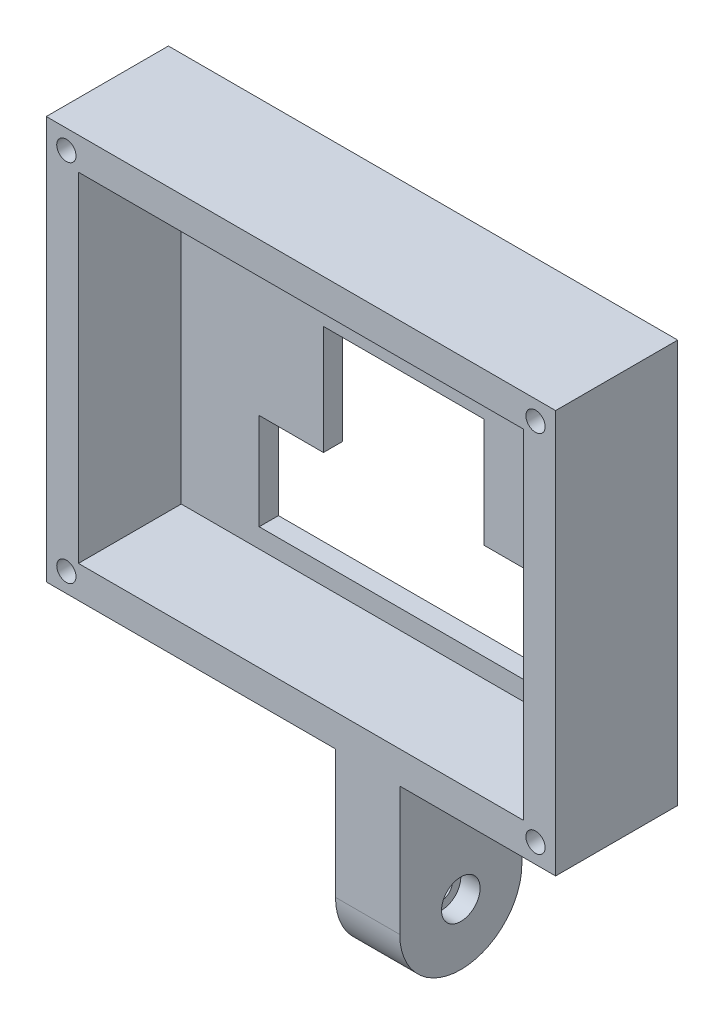
ISO-10303-21;
HEADER;
FILE_DESCRIPTION(('STEP AP214'),'2;1');
FILE_NAME('part.step','',(''),(''),'','','');
FILE_SCHEMA(('AUTOMOTIVE_DESIGN { 1 0 10303 214 1 1 1 1 }'));
ENDSEC;
DATA;
#1=APPLICATION_CONTEXT('core data for automotive mechanical design processes');
#2=APPLICATION_PROTOCOL_DEFINITION('international standard','automotive_design',2000,#1);
#3=PRODUCT_CONTEXT('',#1,'mechanical');
#4=PRODUCT('Part','Part','',(#3));
#5=PRODUCT_RELATED_PRODUCT_CATEGORY('part','',(#4));
#6=PRODUCT_DEFINITION_FORMATION('','',#4);
#7=PRODUCT_DEFINITION_CONTEXT('part definition',#1,'design');
#8=PRODUCT_DEFINITION('design','',#6,#7);
#9=PRODUCT_DEFINITION_SHAPE('','',#8);
#10=(LENGTH_UNIT() NAMED_UNIT(*) SI_UNIT(.MILLI.,.METRE.));
#11=(NAMED_UNIT(*) PLANE_ANGLE_UNIT() SI_UNIT($,.RADIAN.));
#12=(NAMED_UNIT(*) SI_UNIT($,.STERADIAN.) SOLID_ANGLE_UNIT());
#13=UNCERTAINTY_MEASURE_WITH_UNIT(LENGTH_MEASURE(1.E-05),#10,'distance_accuracy_value','');
#14=(GEOMETRIC_REPRESENTATION_CONTEXT(3) GLOBAL_UNCERTAINTY_ASSIGNED_CONTEXT((#13)) GLOBAL_UNIT_ASSIGNED_CONTEXT((#10,
#11,#12)) REPRESENTATION_CONTEXT('',''));
#15=CARTESIAN_POINT('',(0.,0.,0.));
#16=DIRECTION('',(0.,0.,1.));
#17=DIRECTION('',(1.,0.,0.));
#18=AXIS2_PLACEMENT_3D('',#15,#16,#17);
#19=CARTESIAN_POINT('',(5.37500000000001,-20.,9.5));
#20=DIRECTION('',(1.,0.,0.));
#21=DIRECTION('',(0.,1.,0.));
#22=AXIS2_PLACEMENT_3D('',#19,#20,#21);
#23=CYLINDRICAL_SURFACE('',#22,1.7);
#24=CARTESIAN_POINT('',(5.37500000000001,-20.,9.5));
#25=DIRECTION('',(-1.,0.,0.));
#26=DIRECTION('',(0.,-1.,0.));
#27=AXIS2_PLACEMENT_3D('',#24,#25,#26);
#28=CIRCLE('',#27,1.7);
#29=CARTESIAN_POINT('',(5.37500000000001,-21.7,9.5));
#30=VERTEX_POINT('',#29);
#31=EDGE_CURVE('E203',#30,#30,#28,.T.);
#32=ORIENTED_EDGE('',*,*,#31,.T.);
#33=EDGE_LOOP('',(#32));
#34=FACE_BOUND('',#33,.T.);
#35=CARTESIAN_POINT('',(12.375,-20.,9.5));
#36=DIRECTION('',(1.,0.,0.));
#37=DIRECTION('',(0.,1.,0.));
#38=AXIS2_PLACEMENT_3D('',#35,#36,#37);
#39=CIRCLE('',#38,1.7);
#40=CARTESIAN_POINT('',(12.375,-18.3,9.5));
#41=VERTEX_POINT('',#40);
#42=EDGE_CURVE('E39',#41,#41,#39,.T.);
#43=ORIENTED_EDGE('',*,*,#42,.T.);
#44=EDGE_LOOP('',(#43));
#45=FACE_BOUND('',#44,.T.);
#46=ADVANCED_FACE('F35',(#34,#45),#23,.F.);
#47=CARTESIAN_POINT('',(39.625,0.,19.));
#48=DIRECTION('',(0.,1.,0.));
#49=DIRECTION('',(-1.,0.,0.));
#50=AXIS2_PLACEMENT_3D('',#47,#48,#49);
#51=PLANE('',#50);
#52=DIRECTION('',(0.,0.,-1.));
#53=VECTOR('',#52,1.);
#54=CARTESIAN_POINT('',(5.375,0.,0.));
#55=LINE('',#54,#53);
#56=CARTESIAN_POINT('',(5.375,0.,19.));
#57=VERTEX_POINT('',#56);
#58=CARTESIAN_POINT('',(5.375,0.,0.));
#59=VERTEX_POINT('',#58);
#60=EDGE_CURVE('E60',#57,#59,#55,.T.);
#61=ORIENTED_EDGE('',*,*,#60,.F.);
#62=DIRECTION('',(1.,0.,0.));
#63=VECTOR('',#62,1.);
#64=CARTESIAN_POINT('',(39.625,0.,19.));
#65=LINE('',#64,#63);
#66=CARTESIAN_POINT('',(-39.625,0.,19.));
#67=VERTEX_POINT('',#66);
#68=EDGE_CURVE('E310',#67,#57,#65,.T.);
#69=ORIENTED_EDGE('',*,*,#68,.F.);
#70=DIRECTION('',(0.,0.,-1.));
#71=VECTOR('',#70,1.);
#72=CARTESIAN_POINT('',(-39.625,0.,19.));
#73=LINE('',#72,#71);
#74=CARTESIAN_POINT('',(-39.625,0.,0.));
#75=VERTEX_POINT('',#74);
#76=EDGE_CURVE('E177',#67,#75,#73,.T.);
#77=ORIENTED_EDGE('',*,*,#76,.T.);
#78=DIRECTION('',(1.,0.,0.));
#79=VECTOR('',#78,1.);
#80=CARTESIAN_POINT('',(39.625,0.,0.));
#81=LINE('',#80,#79);
#82=EDGE_CURVE('E173',#75,#59,#81,.T.);
#83=ORIENTED_EDGE('',*,*,#82,.T.);
#84=EDGE_LOOP('',(#61,#69,#77,#83));
#85=FACE_BOUND('',#84,.T.);
#86=ADVANCED_FACE('F175',(#85),#51,.F.);
#87=CARTESIAN_POINT('',(39.625,0.,19.));
#88=DIRECTION('',(-1.,0.,0.));
#89=DIRECTION('',(0.,-1.,0.));
#90=AXIS2_PLACEMENT_3D('',#87,#88,#89);
#91=PLANE('',#90);
#92=DIRECTION('',(0.,1.,0.));
#93=VECTOR('',#92,1.);
#94=CARTESIAN_POINT('',(39.625,0.,0.));
#95=LINE('',#94,#93);
#96=CARTESIAN_POINT('',(39.625,0.,0.));
#97=VERTEX_POINT('',#96);
#98=CARTESIAN_POINT('',(39.625,62.72,0.));
#99=VERTEX_POINT('',#98);
#100=EDGE_CURVE('E297',#97,#99,#95,.T.);
#101=ORIENTED_EDGE('',*,*,#100,.T.);
#102=DIRECTION('',(0.,0.,-1.));
#103=VECTOR('',#102,1.);
#104=CARTESIAN_POINT('',(39.625,62.72,19.));
#105=LINE('',#104,#103);
#106=CARTESIAN_POINT('',(39.625,62.72,19.));
#107=VERTEX_POINT('',#106);
#108=EDGE_CURVE('E325',#107,#99,#105,.T.);
#109=ORIENTED_EDGE('',*,*,#108,.F.);
#110=DIRECTION('',(0.,1.,0.));
#111=VECTOR('',#110,1.);
#112=CARTESIAN_POINT('',(39.625,0.,19.));
#113=LINE('',#112,#111);
#114=CARTESIAN_POINT('',(39.625,0.,19.));
#115=VERTEX_POINT('',#114);
#116=EDGE_CURVE('E180',#115,#107,#113,.T.);
#117=ORIENTED_EDGE('',*,*,#116,.F.);
#118=DIRECTION('',(0.,0.,-1.));
#119=VECTOR('',#118,1.);
#120=CARTESIAN_POINT('',(39.625,0.,19.));
#121=LINE('',#120,#119);
#122=EDGE_CURVE('E312',#115,#97,#121,.T.);
#123=ORIENTED_EDGE('',*,*,#122,.T.);
#124=EDGE_LOOP('',(#101,#109,#117,#123));
#125=FACE_BOUND('',#124,.T.);
#126=ADVANCED_FACE('F37',(#125),#91,.F.);
#127=CARTESIAN_POINT('',(39.625,62.72,19.));
#128=DIRECTION('',(0.,-1.,0.));
#129=DIRECTION('',(1.,0.,0.));
#130=AXIS2_PLACEMENT_3D('',#127,#128,#129);
#131=PLANE('',#130);
#132=DIRECTION('',(-1.,0.,0.));
#133=VECTOR('',#132,1.);
#134=CARTESIAN_POINT('',(39.625,62.72,0.));
#135=LINE('',#134,#133);
#136=CARTESIAN_POINT('',(-39.625,62.72,0.));
#137=VERTEX_POINT('',#136);
#138=EDGE_CURVE('E315',#99,#137,#135,.T.);
#139=ORIENTED_EDGE('',*,*,#138,.T.);
#140=DIRECTION('',(0.,0.,-1.));
#141=VECTOR('',#140,1.);
#142=CARTESIAN_POINT('',(-39.625,62.72,19.));
#143=LINE('',#142,#141);
#144=CARTESIAN_POINT('',(-39.625,62.72,19.));
#145=VERTEX_POINT('',#144);
#146=EDGE_CURVE('E322',#145,#137,#143,.T.);
#147=ORIENTED_EDGE('',*,*,#146,.F.);
#148=DIRECTION('',(-1.,0.,0.));
#149=VECTOR('',#148,1.);
#150=CARTESIAN_POINT('',(39.625,62.72,19.));
#151=LINE('',#150,#149);
#152=EDGE_CURVE('E306',#107,#145,#151,.T.);
#153=ORIENTED_EDGE('',*,*,#152,.F.);
#154=ORIENTED_EDGE('',*,*,#108,.T.);
#155=EDGE_LOOP('',(#139,#147,#153,#154));
#156=FACE_BOUND('',#155,.T.);
#157=ADVANCED_FACE('F487',(#156),#131,.F.);
#158=CARTESIAN_POINT('',(-39.625,0.,19.));
#159=DIRECTION('',(1.,0.,0.));
#160=DIRECTION('',(0.,1.,0.));
#161=AXIS2_PLACEMENT_3D('',#158,#159,#160);
#162=PLANE('',#161);
#163=DIRECTION('',(0.,-1.,0.));
#164=VECTOR('',#163,1.);
#165=CARTESIAN_POINT('',(-39.625,0.,0.));
#166=LINE('',#165,#164);
#167=EDGE_CURVE('E317',#137,#75,#166,.T.);
#168=ORIENTED_EDGE('',*,*,#167,.T.);
#169=ORIENTED_EDGE('',*,*,#76,.F.);
#170=DIRECTION('',(0.,-1.,0.));
#171=VECTOR('',#170,1.);
#172=CARTESIAN_POINT('',(-39.625,0.,19.));
#173=LINE('',#172,#171);
#174=EDGE_CURVE('E308',#145,#67,#173,.T.);
#175=ORIENTED_EDGE('',*,*,#174,.F.);
#176=ORIENTED_EDGE('',*,*,#146,.T.);
#177=EDGE_LOOP('',(#168,#169,#175,#176));
#178=FACE_BOUND('',#177,.T.);
#179=ADVANCED_FACE('F485',(#178),#162,.F.);
#180=CARTESIAN_POINT('',(15.375,0.,19.));
#181=VERTEX_POINT('',#180);
#182=EDGE_CURVE('E52',#181,#115,#65,.T.);
#183=ORIENTED_EDGE('',*,*,#182,.F.);
#184=DIRECTION('',(0.,0.,-1.));
#185=VECTOR('',#184,1.);
#186=CARTESIAN_POINT('',(15.375,0.,0.));
#187=LINE('',#186,#185);
#188=CARTESIAN_POINT('',(15.375,0.,0.));
#189=VERTEX_POINT('',#188);
#190=EDGE_CURVE('E209',#181,#189,#187,.T.);
#191=ORIENTED_EDGE('',*,*,#190,.T.);
#192=EDGE_CURVE('E181',#189,#97,#81,.T.);
#193=ORIENTED_EDGE('',*,*,#192,.T.);
#194=ORIENTED_EDGE('',*,*,#122,.F.);
#195=EDGE_LOOP('',(#183,#191,#193,#194));
#196=FACE_BOUND('',#195,.T.);
#197=ADVANCED_FACE('F379',(#196),#51,.F.);
#198=CARTESIAN_POINT('',(0.,0.,19.));
#199=DIRECTION('',(0.,0.,1.));
#200=DIRECTION('',(1.,0.,0.));
#201=AXIS2_PLACEMENT_3D('',#198,#199,#200);
#202=PLANE('',#201);
#203=CARTESIAN_POINT('',(-36.5,59.72,19.));
#204=DIRECTION('',(0.,0.,-1.));
#205=DIRECTION('',(1.,0.,0.));
#206=AXIS2_PLACEMENT_3D('',#203,#204,#205);
#207=CIRCLE('',#206,1.5);
#208=CARTESIAN_POINT('',(-35.,59.72,19.));
#209=VERTEX_POINT('',#208);
#210=EDGE_CURVE('E221',#209,#209,#207,.T.);
#211=ORIENTED_EDGE('',*,*,#210,.T.);
#212=EDGE_LOOP('',(#211));
#213=FACE_BOUND('',#212,.T.);
#214=CARTESIAN_POINT('',(36.5,3.00000000000002,19.));
#215=DIRECTION('',(0.,0.,-1.));
#216=DIRECTION('',(1.,0.,0.));
#217=AXIS2_PLACEMENT_3D('',#214,#215,#216);
#218=CIRCLE('',#217,1.5);
#219=CARTESIAN_POINT('',(38.,3.00000000000002,19.));
#220=VERTEX_POINT('',#219);
#221=EDGE_CURVE('E220',#220,#220,#218,.T.);
#222=ORIENTED_EDGE('',*,*,#221,.T.);
#223=EDGE_LOOP('',(#222));
#224=FACE_BOUND('',#223,.T.);
#225=CARTESIAN_POINT('',(-36.5,3.00000000000002,19.));
#226=DIRECTION('',(0.,0.,-1.));
#227=DIRECTION('',(-1.,0.,0.));
#228=AXIS2_PLACEMENT_3D('',#225,#226,#227);
#229=CIRCLE('',#228,1.5);
#230=CARTESIAN_POINT('',(-38.,3.00000000000002,19.));
#231=VERTEX_POINT('',#230);
#232=EDGE_CURVE('E217',#231,#231,#229,.T.);
#233=ORIENTED_EDGE('',*,*,#232,.T.);
#234=EDGE_LOOP('',(#233));
#235=FACE_BOUND('',#234,.T.);
#236=CARTESIAN_POINT('',(36.5,59.72,19.));
#237=DIRECTION('',(0.,0.,-1.));
#238=DIRECTION('',(-1.,0.,0.));
#239=AXIS2_PLACEMENT_3D('',#236,#237,#238);
#240=CIRCLE('',#239,1.5);
#241=CARTESIAN_POINT('',(35.,59.72,19.));
#242=VERTEX_POINT('',#241);
#243=EDGE_CURVE('E224',#242,#242,#240,.T.);
#244=ORIENTED_EDGE('',*,*,#243,.T.);
#245=EDGE_LOOP('',(#244));
#246=FACE_BOUND('',#245,.T.);
#247=DIRECTION('',(0.,-1.,0.));
#248=VECTOR('',#247,1.);
#249=CARTESIAN_POINT('',(-34.625,57.72,19.));
#250=LINE('',#249,#248);
#251=CARTESIAN_POINT('',(-34.625,57.72,19.));
#252=VERTEX_POINT('',#251);
#253=CARTESIAN_POINT('',(-34.625,4.99999999999998,19.));
#254=VERTEX_POINT('',#253);
#255=EDGE_CURVE('E257',#252,#254,#250,.T.);
#256=ORIENTED_EDGE('',*,*,#255,.F.);
#257=DIRECTION('',(-1.,0.,0.));
#258=VECTOR('',#257,1.);
#259=CARTESIAN_POINT('',(-34.625,57.72,19.));
#260=LINE('',#259,#258);
#261=CARTESIAN_POINT('',(34.625,57.72,19.));
#262=VERTEX_POINT('',#261);
#263=EDGE_CURVE('E276',#262,#252,#260,.T.);
#264=ORIENTED_EDGE('',*,*,#263,.F.);
#265=DIRECTION('',(0.,1.,0.));
#266=VECTOR('',#265,1.);
#267=CARTESIAN_POINT('',(34.625,57.72,19.));
#268=LINE('',#267,#266);
#269=CARTESIAN_POINT('',(34.625,4.99999999999998,19.));
#270=VERTEX_POINT('',#269);
#271=EDGE_CURVE('E290',#270,#262,#268,.T.);
#272=ORIENTED_EDGE('',*,*,#271,.F.);
#273=DIRECTION('',(1.,0.,0.));
#274=VECTOR('',#273,1.);
#275=CARTESIAN_POINT('',(-34.625,4.99999999999998,19.));
#276=LINE('',#275,#274);
#277=EDGE_CURVE('E287',#254,#270,#276,.T.);
#278=ORIENTED_EDGE('',*,*,#277,.F.);
#279=EDGE_LOOP('',(#256,#264,#272,#278));
#280=FACE_BOUND('',#279,.T.);
#281=ORIENTED_EDGE('',*,*,#116,.T.);
#282=ORIENTED_EDGE('',*,*,#152,.T.);
#283=ORIENTED_EDGE('',*,*,#174,.T.);
#284=ORIENTED_EDGE('',*,*,#68,.T.);
#285=DIRECTION('',(0.,1.,0.));
#286=VECTOR('',#285,1.);
#287=CARTESIAN_POINT('',(5.375,0.,19.));
#288=LINE('',#287,#286);
#289=CARTESIAN_POINT('',(5.37500000000001,-20.,19.));
#290=VERTEX_POINT('',#289);
#291=EDGE_CURVE('E197',#290,#57,#288,.T.);
#292=ORIENTED_EDGE('',*,*,#291,.F.);
#293=DIRECTION('',(1.,0.,0.));
#294=VECTOR('',#293,1.);
#295=CARTESIAN_POINT('',(5.37500000000001,-20.,19.));
#296=LINE('',#295,#294);
#297=CARTESIAN_POINT('',(15.375,-20.,19.));
#298=VERTEX_POINT('',#297);
#299=EDGE_CURVE('E208',#290,#298,#296,.T.);
#300=ORIENTED_EDGE('',*,*,#299,.T.);
#301=DIRECTION('',(0.,1.,0.));
#302=VECTOR('',#301,1.);
#303=CARTESIAN_POINT('',(15.375,0.,19.));
#304=LINE('',#303,#302);
#305=EDGE_CURVE('E198',#298,#181,#304,.T.);
#306=ORIENTED_EDGE('',*,*,#305,.T.);
#307=ORIENTED_EDGE('',*,*,#182,.T.);
#308=EDGE_LOOP('',(#281,#282,#283,#284,#292,#300,#306,#307));
#309=FACE_BOUND('',#308,.T.);
#310=ADVANCED_FACE('F407',(#213,#224,#235,#246,#280,#309),#202,.T.);
#311=CARTESIAN_POINT('',(0.,0.,0.));
#312=DIRECTION('',(0.,0.,1.));
#313=DIRECTION('',(1.,0.,0.));
#314=AXIS2_PLACEMENT_3D('',#311,#312,#313);
#315=PLANE('',#314);
#316=CARTESIAN_POINT('',(-36.5,59.72,0.));
#317=DIRECTION('',(0.,0.,1.));
#318=DIRECTION('',(1.,0.,0.));
#319=AXIS2_PLACEMENT_3D('',#316,#317,#318);
#320=CIRCLE('',#319,1.5);
#321=CARTESIAN_POINT('',(-35.,59.72,0.));
#322=VERTEX_POINT('',#321);
#323=EDGE_CURVE('E233',#322,#322,#320,.T.);
#324=ORIENTED_EDGE('',*,*,#323,.T.);
#325=EDGE_LOOP('',(#324));
#326=FACE_BOUND('',#325,.T.);
#327=CARTESIAN_POINT('',(36.5,3.00000000000002,0.));
#328=DIRECTION('',(0.,0.,1.));
#329=DIRECTION('',(1.,0.,0.));
#330=AXIS2_PLACEMENT_3D('',#327,#328,#329);
#331=CIRCLE('',#330,1.5);
#332=CARTESIAN_POINT('',(38.,3.00000000000002,0.));
#333=VERTEX_POINT('',#332);
#334=EDGE_CURVE('E347',#333,#333,#331,.T.);
#335=ORIENTED_EDGE('',*,*,#334,.T.);
#336=EDGE_LOOP('',(#335));
#337=FACE_BOUND('',#336,.T.);
#338=CARTESIAN_POINT('',(-36.5,3.00000000000002,0.));
#339=DIRECTION('',(0.,0.,1.));
#340=DIRECTION('',(1.,0.,0.));
#341=AXIS2_PLACEMENT_3D('',#338,#339,#340);
#342=CIRCLE('',#341,1.5);
#343=CARTESIAN_POINT('',(-35.,3.00000000000002,0.));
#344=VERTEX_POINT('',#343);
#345=EDGE_CURVE('E344',#344,#344,#342,.T.);
#346=ORIENTED_EDGE('',*,*,#345,.T.);
#347=EDGE_LOOP('',(#346));
#348=FACE_BOUND('',#347,.T.);
#349=CARTESIAN_POINT('',(36.5,59.72,0.));
#350=DIRECTION('',(0.,0.,1.));
#351=DIRECTION('',(1.,0.,0.));
#352=AXIS2_PLACEMENT_3D('',#349,#350,#351);
#353=CIRCLE('',#352,1.5);
#354=CARTESIAN_POINT('',(38.,59.72,0.));
#355=VERTEX_POINT('',#354);
#356=EDGE_CURVE('E229',#355,#355,#353,.T.);
#357=ORIENTED_EDGE('',*,*,#356,.T.);
#358=EDGE_LOOP('',(#357));
#359=FACE_BOUND('',#358,.T.);
#360=DIRECTION('',(1.,0.,0.));
#361=VECTOR('',#360,1.);
#362=CARTESIAN_POINT('',(12.5,23.,0.));
#363=LINE('',#362,#361);
#364=CARTESIAN_POINT('',(12.5,23.,0.));
#365=VERTEX_POINT('',#364);
#366=CARTESIAN_POINT('',(22.5,23.,0.));
#367=VERTEX_POINT('',#366);
#368=EDGE_CURVE('E232',#365,#367,#363,.T.);
#369=ORIENTED_EDGE('',*,*,#368,.F.);
#370=DIRECTION('',(0.,-1.,0.));
#371=VECTOR('',#370,1.);
#372=CARTESIAN_POINT('',(12.5,40.,0.));
#373=LINE('',#372,#371);
#374=CARTESIAN_POINT('',(12.5,40.,0.));
#375=VERTEX_POINT('',#374);
#376=EDGE_CURVE('E230',#375,#365,#373,.T.);
#377=ORIENTED_EDGE('',*,*,#376,.F.);
#378=DIRECTION('',(1.,0.,0.));
#379=VECTOR('',#378,1.);
#380=CARTESIAN_POINT('',(-12.5,40.,0.));
#381=LINE('',#380,#379);
#382=CARTESIAN_POINT('',(-12.5,40.,0.));
#383=VERTEX_POINT('',#382);
#384=EDGE_CURVE('E251',#383,#375,#381,.T.);
#385=ORIENTED_EDGE('',*,*,#384,.F.);
#386=DIRECTION('',(0.,1.,0.));
#387=VECTOR('',#386,1.);
#388=CARTESIAN_POINT('',(-12.5,40.,0.));
#389=LINE('',#388,#387);
#390=CARTESIAN_POINT('',(-12.5,23.,0.));
#391=VERTEX_POINT('',#390);
#392=EDGE_CURVE('E248',#391,#383,#389,.T.);
#393=ORIENTED_EDGE('',*,*,#392,.F.);
#394=DIRECTION('',(1.,0.,0.));
#395=VECTOR('',#394,1.);
#396=CARTESIAN_POINT('',(-12.5,23.,0.));
#397=LINE('',#396,#395);
#398=CARTESIAN_POINT('',(-22.5,23.,0.));
#399=VERTEX_POINT('',#398);
#400=EDGE_CURVE('E245',#399,#391,#397,.T.);
#401=ORIENTED_EDGE('',*,*,#400,.F.);
#402=DIRECTION('',(0.,1.,0.));
#403=VECTOR('',#402,1.);
#404=CARTESIAN_POINT('',(-22.5,23.,0.));
#405=LINE('',#404,#403);
#406=CARTESIAN_POINT('',(-22.5,7.99999999999999,0.));
#407=VERTEX_POINT('',#406);
#408=EDGE_CURVE('E242',#407,#399,#405,.T.);
#409=ORIENTED_EDGE('',*,*,#408,.F.);
#410=DIRECTION('',(-1.,0.,0.));
#411=VECTOR('',#410,1.);
#412=CARTESIAN_POINT('',(22.5,7.99999999999999,0.));
#413=LINE('',#412,#411);
#414=CARTESIAN_POINT('',(22.5,7.99999999999999,0.));
#415=VERTEX_POINT('',#414);
#416=EDGE_CURVE('E239',#415,#407,#413,.T.);
#417=ORIENTED_EDGE('',*,*,#416,.F.);
#418=DIRECTION('',(0.,-1.,0.));
#419=VECTOR('',#418,1.);
#420=CARTESIAN_POINT('',(22.5,23.,0.));
#421=LINE('',#420,#419);
#422=EDGE_CURVE('E236',#367,#415,#421,.T.);
#423=ORIENTED_EDGE('',*,*,#422,.F.);
#424=EDGE_LOOP('',(#369,#377,#385,#393,#401,#409,#417,#423));
#425=FACE_BOUND('',#424,.T.);
#426=ORIENTED_EDGE('',*,*,#100,.F.);
#427=ORIENTED_EDGE('',*,*,#192,.F.);
#428=DIRECTION('',(0.,-1.,0.));
#429=VECTOR('',#428,1.);
#430=CARTESIAN_POINT('',(15.375,0.,0.));
#431=LINE('',#430,#429);
#432=CARTESIAN_POINT('',(15.375,-20.,0.));
#433=VERTEX_POINT('',#432);
#434=EDGE_CURVE('E211',#189,#433,#431,.T.);
#435=ORIENTED_EDGE('',*,*,#434,.T.);
#436=DIRECTION('',(1.,0.,0.));
#437=VECTOR('',#436,1.);
#438=CARTESIAN_POINT('',(5.37500000000001,-20.,0.));
#439=LINE('',#438,#437);
#440=CARTESIAN_POINT('',(5.37500000000001,-20.,0.));
#441=VERTEX_POINT('',#440);
#442=EDGE_CURVE('E188',#441,#433,#439,.T.);
#443=ORIENTED_EDGE('',*,*,#442,.F.);
#444=DIRECTION('',(0.,-1.,0.));
#445=VECTOR('',#444,1.);
#446=CARTESIAN_POINT('',(5.375,0.,0.));
#447=LINE('',#446,#445);
#448=EDGE_CURVE('E184',#59,#441,#447,.T.);
#449=ORIENTED_EDGE('',*,*,#448,.F.);
#450=ORIENTED_EDGE('',*,*,#82,.F.);
#451=ORIENTED_EDGE('',*,*,#167,.F.);
#452=ORIENTED_EDGE('',*,*,#138,.F.);
#453=EDGE_LOOP('',(#426,#427,#435,#443,#449,#450,#451,#452));
#454=FACE_BOUND('',#453,.T.);
#455=ADVANCED_FACE('F186',(#326,#337,#348,#359,#425,#454),#315,.F.);
#456=CARTESIAN_POINT('',(-34.625,57.72,3.));
#457=DIRECTION('',(-1.,0.,0.));
#458=DIRECTION('',(0.,-1.,0.));
#459=AXIS2_PLACEMENT_3D('',#456,#457,#458);
#460=PLANE('',#459);
#461=ORIENTED_EDGE('',*,*,#255,.T.);
#462=DIRECTION('',(0.,0.,1.));
#463=VECTOR('',#462,1.);
#464=CARTESIAN_POINT('',(-34.625,4.99999999999998,3.));
#465=LINE('',#464,#463);
#466=CARTESIAN_POINT('',(-34.625,4.99999999999998,3.));
#467=VERTEX_POINT('',#466);
#468=EDGE_CURVE('E285',#467,#254,#465,.T.);
#469=ORIENTED_EDGE('',*,*,#468,.F.);
#470=DIRECTION('',(0.,-1.,0.));
#471=VECTOR('',#470,1.);
#472=CARTESIAN_POINT('',(-34.625,57.72,3.));
#473=LINE('',#472,#471);
#474=CARTESIAN_POINT('',(-34.625,57.72,3.));
#475=VERTEX_POINT('',#474);
#476=EDGE_CURVE('E272',#475,#467,#473,.T.);
#477=ORIENTED_EDGE('',*,*,#476,.F.);
#478=DIRECTION('',(0.,0.,1.));
#479=VECTOR('',#478,1.);
#480=CARTESIAN_POINT('',(-34.625,57.72,3.));
#481=LINE('',#480,#479);
#482=EDGE_CURVE('E295',#475,#252,#481,.T.);
#483=ORIENTED_EDGE('',*,*,#482,.T.);
#484=EDGE_LOOP('',(#461,#469,#477,#483));
#485=FACE_BOUND('',#484,.T.);
#486=ADVANCED_FACE('F406',(#485),#460,.F.);
#487=CARTESIAN_POINT('',(-34.625,57.72,3.));
#488=DIRECTION('',(0.,1.,0.));
#489=DIRECTION('',(0.,0.,1.));
#490=AXIS2_PLACEMENT_3D('',#487,#488,#489);
#491=PLANE('',#490);
#492=ORIENTED_EDGE('',*,*,#263,.T.);
#493=ORIENTED_EDGE('',*,*,#482,.F.);
#494=DIRECTION('',(-1.,0.,0.));
#495=VECTOR('',#494,1.);
#496=CARTESIAN_POINT('',(-34.625,57.72,3.));
#497=LINE('',#496,#495);
#498=CARTESIAN_POINT('',(34.625,57.72,3.));
#499=VERTEX_POINT('',#498);
#500=EDGE_CURVE('E282',#499,#475,#497,.T.);
#501=ORIENTED_EDGE('',*,*,#500,.F.);
#502=DIRECTION('',(0.,0.,1.));
#503=VECTOR('',#502,1.);
#504=CARTESIAN_POINT('',(34.625,57.72,3.));
#505=LINE('',#504,#503);
#506=EDGE_CURVE('E298',#499,#262,#505,.T.);
#507=ORIENTED_EDGE('',*,*,#506,.T.);
#508=EDGE_LOOP('',(#492,#493,#501,#507));
#509=FACE_BOUND('',#508,.T.);
#510=ADVANCED_FACE('F467',(#509),#491,.F.);
#511=CARTESIAN_POINT('',(34.625,57.72,3.));
#512=DIRECTION('',(1.,0.,0.));
#513=DIRECTION('',(0.,1.,0.));
#514=AXIS2_PLACEMENT_3D('',#511,#512,#513);
#515=PLANE('',#514);
#516=ORIENTED_EDGE('',*,*,#271,.T.);
#517=ORIENTED_EDGE('',*,*,#506,.F.);
#518=DIRECTION('',(0.,1.,0.));
#519=VECTOR('',#518,1.);
#520=CARTESIAN_POINT('',(34.625,57.72,3.));
#521=LINE('',#520,#519);
#522=CARTESIAN_POINT('',(34.625,4.99999999999998,3.));
#523=VERTEX_POINT('',#522);
#524=EDGE_CURVE('E279',#523,#499,#521,.T.);
#525=ORIENTED_EDGE('',*,*,#524,.F.);
#526=DIRECTION('',(0.,0.,1.));
#527=VECTOR('',#526,1.);
#528=CARTESIAN_POINT('',(34.625,4.99999999999998,3.));
#529=LINE('',#528,#527);
#530=EDGE_CURVE('E300',#523,#270,#529,.T.);
#531=ORIENTED_EDGE('',*,*,#530,.T.);
#532=EDGE_LOOP('',(#516,#517,#525,#531));
#533=FACE_BOUND('',#532,.T.);
#534=ADVANCED_FACE('F470',(#533),#515,.F.);
#535=CARTESIAN_POINT('',(-34.625,4.99999999999998,3.));
#536=DIRECTION('',(0.,-1.,0.));
#537=DIRECTION('',(0.,0.,-1.));
#538=AXIS2_PLACEMENT_3D('',#535,#536,#537);
#539=PLANE('',#538);
#540=ORIENTED_EDGE('',*,*,#277,.T.);
#541=ORIENTED_EDGE('',*,*,#530,.F.);
#542=DIRECTION('',(1.,0.,0.));
#543=VECTOR('',#542,1.);
#544=CARTESIAN_POINT('',(-34.625,4.99999999999998,3.));
#545=LINE('',#544,#543);
#546=EDGE_CURVE('E275',#467,#523,#545,.T.);
#547=ORIENTED_EDGE('',*,*,#546,.F.);
#548=ORIENTED_EDGE('',*,*,#468,.T.);
#549=EDGE_LOOP('',(#540,#541,#547,#548));
#550=FACE_BOUND('',#549,.T.);
#551=ADVANCED_FACE('F466',(#550),#539,.F.);
#552=CARTESIAN_POINT('',(0.,0.,3.));
#553=DIRECTION('',(0.,0.,1.));
#554=DIRECTION('',(1.,0.,0.));
#555=AXIS2_PLACEMENT_3D('',#552,#553,#554);
#556=PLANE('',#555);
#557=DIRECTION('',(0.,1.,0.));
#558=VECTOR('',#557,1.);
#559=CARTESIAN_POINT('',(12.5,0.,3.));
#560=LINE('',#559,#558);
#561=CARTESIAN_POINT('',(12.5,23.,3.));
#562=VERTEX_POINT('',#561);
#563=CARTESIAN_POINT('',(12.5,40.,3.));
#564=VERTEX_POINT('',#563);
#565=EDGE_CURVE('E11',#562,#564,#560,.T.);
#566=ORIENTED_EDGE('',*,*,#565,.F.);
#567=DIRECTION('',(-1.,0.,0.));
#568=VECTOR('',#567,1.);
#569=CARTESIAN_POINT('',(0.,23.,3.));
#570=LINE('',#569,#568);
#571=CARTESIAN_POINT('',(22.5,23.,3.));
#572=VERTEX_POINT('',#571);
#573=EDGE_CURVE('E328',#572,#562,#570,.T.);
#574=ORIENTED_EDGE('',*,*,#573,.F.);
#575=DIRECTION('',(0.,1.,0.));
#576=VECTOR('',#575,1.);
#577=CARTESIAN_POINT('',(22.5,0.,3.));
#578=LINE('',#577,#576);
#579=CARTESIAN_POINT('',(22.5,7.99999999999999,3.));
#580=VERTEX_POINT('',#579);
#581=EDGE_CURVE('E330',#580,#572,#578,.T.);
#582=ORIENTED_EDGE('',*,*,#581,.F.);
#583=DIRECTION('',(1.,0.,0.));
#584=VECTOR('',#583,1.);
#585=CARTESIAN_POINT('',(0.,7.99999999999999,3.));
#586=LINE('',#585,#584);
#587=CARTESIAN_POINT('',(-22.5,7.99999999999999,3.));
#588=VERTEX_POINT('',#587);
#589=EDGE_CURVE('E333',#588,#580,#586,.T.);
#590=ORIENTED_EDGE('',*,*,#589,.F.);
#591=DIRECTION('',(0.,-1.,0.));
#592=VECTOR('',#591,1.);
#593=CARTESIAN_POINT('',(-22.5,0.,3.));
#594=LINE('',#593,#592);
#595=CARTESIAN_POINT('',(-22.5,23.,3.));
#596=VERTEX_POINT('',#595);
#597=EDGE_CURVE('E335',#596,#588,#594,.T.);
#598=ORIENTED_EDGE('',*,*,#597,.F.);
#599=DIRECTION('',(-1.,0.,0.));
#600=VECTOR('',#599,1.);
#601=CARTESIAN_POINT('',(0.,23.,3.));
#602=LINE('',#601,#600);
#603=CARTESIAN_POINT('',(-12.5,23.,3.));
#604=VERTEX_POINT('',#603);
#605=EDGE_CURVE('E337',#604,#596,#602,.T.);
#606=ORIENTED_EDGE('',*,*,#605,.F.);
#607=DIRECTION('',(0.,-1.,0.));
#608=VECTOR('',#607,1.);
#609=CARTESIAN_POINT('',(-12.5,0.,3.));
#610=LINE('',#609,#608);
#611=CARTESIAN_POINT('',(-12.5,40.,3.));
#612=VERTEX_POINT('',#611);
#613=EDGE_CURVE('E339',#612,#604,#610,.T.);
#614=ORIENTED_EDGE('',*,*,#613,.F.);
#615=DIRECTION('',(-1.,0.,0.));
#616=VECTOR('',#615,1.);
#617=CARTESIAN_POINT('',(0.,40.,3.));
#618=LINE('',#617,#616);
#619=EDGE_CURVE('E44',#564,#612,#618,.T.);
#620=ORIENTED_EDGE('',*,*,#619,.F.);
#621=EDGE_LOOP('',(#566,#574,#582,#590,#598,#606,#614,#620));
#622=FACE_BOUND('',#621,.T.);
#623=ORIENTED_EDGE('',*,*,#476,.T.);
#624=ORIENTED_EDGE('',*,*,#546,.T.);
#625=ORIENTED_EDGE('',*,*,#524,.T.);
#626=ORIENTED_EDGE('',*,*,#500,.T.);
#627=EDGE_LOOP('',(#623,#624,#625,#626));
#628=FACE_BOUND('',#627,.T.);
#629=ADVANCED_FACE('F425',(#622,#628),#556,.T.);
#630=CARTESIAN_POINT('',(12.5,40.,10.));
#631=DIRECTION('',(1.,0.,0.));
#632=DIRECTION('',(0.,1.,0.));
#633=AXIS2_PLACEMENT_3D('',#630,#631,#632);
#634=PLANE('',#633);
#635=ORIENTED_EDGE('',*,*,#565,.T.);
#636=DIRECTION('',(0.,0.,-1.));
#637=VECTOR('',#636,1.);
#638=CARTESIAN_POINT('',(12.5,40.,10.));
#639=LINE('',#638,#637);
#640=EDGE_CURVE('E255',#564,#375,#639,.T.);
#641=ORIENTED_EDGE('',*,*,#640,.T.);
#642=ORIENTED_EDGE('',*,*,#376,.T.);
#643=DIRECTION('',(0.,0.,-1.));
#644=VECTOR('',#643,1.);
#645=CARTESIAN_POINT('',(12.5,23.,10.));
#646=LINE('',#645,#644);
#647=EDGE_CURVE('E254',#562,#365,#646,.T.);
#648=ORIENTED_EDGE('',*,*,#647,.F.);
#649=EDGE_LOOP('',(#635,#641,#642,#648));
#650=FACE_BOUND('',#649,.T.);
#651=ADVANCED_FACE('F421',(#650),#634,.F.);
#652=CARTESIAN_POINT('',(-12.5,40.,10.));
#653=DIRECTION('',(0.,1.,0.));
#654=DIRECTION('',(0.,0.,1.));
#655=AXIS2_PLACEMENT_3D('',#652,#653,#654);
#656=PLANE('',#655);
#657=ORIENTED_EDGE('',*,*,#619,.T.);
#658=DIRECTION('',(0.,0.,-1.));
#659=VECTOR('',#658,1.);
#660=CARTESIAN_POINT('',(-12.5,40.,10.));
#661=LINE('',#660,#659);
#662=EDGE_CURVE('E258',#612,#383,#661,.T.);
#663=ORIENTED_EDGE('',*,*,#662,.T.);
#664=ORIENTED_EDGE('',*,*,#384,.T.);
#665=ORIENTED_EDGE('',*,*,#640,.F.);
#666=EDGE_LOOP('',(#657,#663,#664,#665));
#667=FACE_BOUND('',#666,.T.);
#668=ADVANCED_FACE('F432',(#667),#656,.F.);
#669=CARTESIAN_POINT('',(-12.5,40.,10.));
#670=DIRECTION('',(-1.,0.,0.));
#671=DIRECTION('',(0.,-1.,0.));
#672=AXIS2_PLACEMENT_3D('',#669,#670,#671);
#673=PLANE('',#672);
#674=ORIENTED_EDGE('',*,*,#613,.T.);
#675=DIRECTION('',(0.,0.,-1.));
#676=VECTOR('',#675,1.);
#677=CARTESIAN_POINT('',(-12.5,23.,10.));
#678=LINE('',#677,#676);
#679=EDGE_CURVE('E260',#604,#391,#678,.T.);
#680=ORIENTED_EDGE('',*,*,#679,.T.);
#681=ORIENTED_EDGE('',*,*,#392,.T.);
#682=ORIENTED_EDGE('',*,*,#662,.F.);
#683=EDGE_LOOP('',(#674,#680,#681,#682));
#684=FACE_BOUND('',#683,.T.);
#685=ADVANCED_FACE('F434',(#684),#673,.F.);
#686=CARTESIAN_POINT('',(-12.5,23.,10.));
#687=DIRECTION('',(0.,1.,0.));
#688=DIRECTION('',(0.,0.,1.));
#689=AXIS2_PLACEMENT_3D('',#686,#687,#688);
#690=PLANE('',#689);
#691=ORIENTED_EDGE('',*,*,#605,.T.);
#692=DIRECTION('',(0.,0.,-1.));
#693=VECTOR('',#692,1.);
#694=CARTESIAN_POINT('',(-22.5,23.,10.));
#695=LINE('',#694,#693);
#696=EDGE_CURVE('E262',#596,#399,#695,.T.);
#697=ORIENTED_EDGE('',*,*,#696,.T.);
#698=ORIENTED_EDGE('',*,*,#400,.T.);
#699=ORIENTED_EDGE('',*,*,#679,.F.);
#700=EDGE_LOOP('',(#691,#697,#698,#699));
#701=FACE_BOUND('',#700,.T.);
#702=ADVANCED_FACE('F440',(#701),#690,.F.);
#703=CARTESIAN_POINT('',(-22.5,23.,10.));
#704=DIRECTION('',(-1.,0.,0.));
#705=DIRECTION('',(0.,-1.,0.));
#706=AXIS2_PLACEMENT_3D('',#703,#704,#705);
#707=PLANE('',#706);
#708=ORIENTED_EDGE('',*,*,#597,.T.);
#709=DIRECTION('',(0.,0.,-1.));
#710=VECTOR('',#709,1.);
#711=CARTESIAN_POINT('',(-22.5,7.99999999999999,10.));
#712=LINE('',#711,#710);
#713=EDGE_CURVE('E264',#588,#407,#712,.T.);
#714=ORIENTED_EDGE('',*,*,#713,.T.);
#715=ORIENTED_EDGE('',*,*,#408,.T.);
#716=ORIENTED_EDGE('',*,*,#696,.F.);
#717=EDGE_LOOP('',(#708,#714,#715,#716));
#718=FACE_BOUND('',#717,.T.);
#719=ADVANCED_FACE('F444',(#718),#707,.F.);
#720=CARTESIAN_POINT('',(22.5,7.99999999999999,10.));
#721=DIRECTION('',(0.,-1.,0.));
#722=DIRECTION('',(0.,0.,-1.));
#723=AXIS2_PLACEMENT_3D('',#720,#721,#722);
#724=PLANE('',#723);
#725=ORIENTED_EDGE('',*,*,#589,.T.);
#726=DIRECTION('',(0.,0.,-1.));
#727=VECTOR('',#726,1.);
#728=CARTESIAN_POINT('',(22.5,7.99999999999999,10.));
#729=LINE('',#728,#727);
#730=EDGE_CURVE('E266',#580,#415,#729,.T.);
#731=ORIENTED_EDGE('',*,*,#730,.T.);
#732=ORIENTED_EDGE('',*,*,#416,.T.);
#733=ORIENTED_EDGE('',*,*,#713,.F.);
#734=EDGE_LOOP('',(#725,#731,#732,#733));
#735=FACE_BOUND('',#734,.T.);
#736=ADVANCED_FACE('F448',(#735),#724,.F.);
#737=CARTESIAN_POINT('',(22.5,23.,10.));
#738=DIRECTION('',(1.,0.,0.));
#739=DIRECTION('',(0.,1.,0.));
#740=AXIS2_PLACEMENT_3D('',#737,#738,#739);
#741=PLANE('',#740);
#742=ORIENTED_EDGE('',*,*,#581,.T.);
#743=DIRECTION('',(0.,0.,-1.));
#744=VECTOR('',#743,1.);
#745=CARTESIAN_POINT('',(22.5,23.,10.));
#746=LINE('',#745,#744);
#747=EDGE_CURVE('E268',#572,#367,#746,.T.);
#748=ORIENTED_EDGE('',*,*,#747,.T.);
#749=ORIENTED_EDGE('',*,*,#422,.T.);
#750=ORIENTED_EDGE('',*,*,#730,.F.);
#751=EDGE_LOOP('',(#742,#748,#749,#750));
#752=FACE_BOUND('',#751,.T.);
#753=ADVANCED_FACE('F451',(#752),#741,.F.);
#754=CARTESIAN_POINT('',(12.5,23.,10.));
#755=DIRECTION('',(0.,1.,0.));
#756=DIRECTION('',(0.,0.,1.));
#757=AXIS2_PLACEMENT_3D('',#754,#755,#756);
#758=PLANE('',#757);
#759=ORIENTED_EDGE('',*,*,#573,.T.);
#760=ORIENTED_EDGE('',*,*,#647,.T.);
#761=ORIENTED_EDGE('',*,*,#368,.T.);
#762=ORIENTED_EDGE('',*,*,#747,.F.);
#763=EDGE_LOOP('',(#759,#760,#761,#762));
#764=FACE_BOUND('',#763,.T.);
#765=ADVANCED_FACE('F397',(#764),#758,.F.);
#766=CARTESIAN_POINT('',(36.5,59.72,19.));
#767=DIRECTION('',(0.,0.,-1.));
#768=DIRECTION('',(-1.,0.,0.));
#769=AXIS2_PLACEMENT_3D('',#766,#767,#768);
#770=CYLINDRICAL_SURFACE('',#769,1.5);
#771=ORIENTED_EDGE('',*,*,#243,.F.);
#772=EDGE_LOOP('',(#771));
#773=FACE_BOUND('',#772,.T.);
#774=ORIENTED_EDGE('',*,*,#356,.F.);
#775=EDGE_LOOP('',(#774));
#776=FACE_BOUND('',#775,.T.);
#777=ADVANCED_FACE('F392',(#773,#776),#770,.F.);
#778=CARTESIAN_POINT('',(-36.5,3.00000000000002,19.));
#779=DIRECTION('',(0.,0.,-1.));
#780=DIRECTION('',(-1.,0.,0.));
#781=AXIS2_PLACEMENT_3D('',#778,#779,#780);
#782=CYLINDRICAL_SURFACE('',#781,1.5);
#783=ORIENTED_EDGE('',*,*,#232,.F.);
#784=EDGE_LOOP('',(#783));
#785=FACE_BOUND('',#784,.T.);
#786=ORIENTED_EDGE('',*,*,#345,.F.);
#787=EDGE_LOOP('',(#786));
#788=FACE_BOUND('',#787,.T.);
#789=ADVANCED_FACE('F365',(#785,#788),#782,.F.);
#790=CARTESIAN_POINT('',(36.5,3.00000000000002,19.));
#791=DIRECTION('',(0.,0.,-1.));
#792=DIRECTION('',(-1.,0.,0.));
#793=AXIS2_PLACEMENT_3D('',#790,#791,#792);
#794=CYLINDRICAL_SURFACE('',#793,1.5);
#795=ORIENTED_EDGE('',*,*,#221,.F.);
#796=EDGE_LOOP('',(#795));
#797=FACE_BOUND('',#796,.T.);
#798=ORIENTED_EDGE('',*,*,#334,.F.);
#799=EDGE_LOOP('',(#798));
#800=FACE_BOUND('',#799,.T.);
#801=ADVANCED_FACE('F356',(#797,#800),#794,.F.);
#802=CARTESIAN_POINT('',(-36.5,59.72,19.));
#803=DIRECTION('',(0.,0.,-1.));
#804=DIRECTION('',(-1.,0.,0.));
#805=AXIS2_PLACEMENT_3D('',#802,#803,#804);
#806=CYLINDRICAL_SURFACE('',#805,1.5);
#807=ORIENTED_EDGE('',*,*,#210,.F.);
#808=EDGE_LOOP('',(#807));
#809=FACE_BOUND('',#808,.T.);
#810=ORIENTED_EDGE('',*,*,#323,.F.);
#811=EDGE_LOOP('',(#810));
#812=FACE_BOUND('',#811,.T.);
#813=ADVANCED_FACE('F354',(#809,#812),#806,.F.);
#814=CARTESIAN_POINT('',(5.37500000000001,-20.,9.5));
#815=DIRECTION('',(-1.,0.,0.));
#816=DIRECTION('',(0.,-1.,0.));
#817=AXIS2_PLACEMENT_3D('',#814,#815,#816);
#818=PLANE('',#817);
#819=ORIENTED_EDGE('',*,*,#60,.T.);
#820=ORIENTED_EDGE('',*,*,#448,.T.);
#821=CARTESIAN_POINT('',(5.37500000000001,-20.,9.5));
#822=DIRECTION('',(-1.,0.,0.));
#823=DIRECTION('',(0.,-1.,0.));
#824=AXIS2_PLACEMENT_3D('',#821,#822,#823);
#825=CIRCLE('',#824,9.5);
#826=EDGE_CURVE('E191',#441,#290,#825,.T.);
#827=ORIENTED_EDGE('',*,*,#826,.T.);
#828=ORIENTED_EDGE('',*,*,#291,.T.);
#829=EDGE_LOOP('',(#819,#820,#827,#828));
#830=FACE_BOUND('',#829,.T.);
#831=ORIENTED_EDGE('',*,*,#31,.F.);
#832=EDGE_LOOP('',(#831));
#833=FACE_BOUND('',#832,.T.);
#834=ADVANCED_FACE('F194',(#830,#833),#818,.T.);
#835=CARTESIAN_POINT('',(15.375,-20.,9.5));
#836=DIRECTION('',(-1.,0.,0.));
#837=DIRECTION('',(0.,-1.,0.));
#838=AXIS2_PLACEMENT_3D('',#835,#836,#837);
#839=PLANE('',#838);
#840=CARTESIAN_POINT('',(15.375,-20.,9.5));
#841=DIRECTION('',(1.,0.,0.));
#842=DIRECTION('',(0.,1.,0.));
#843=AXIS2_PLACEMENT_3D('',#840,#841,#842);
#844=CIRCLE('',#843,3.);
#845=CARTESIAN_POINT('',(15.375,-17.,9.5));
#846=VERTEX_POINT('',#845);
#847=EDGE_CURVE('E688',#846,#846,#844,.T.);
#848=ORIENTED_EDGE('',*,*,#847,.F.);
#849=EDGE_LOOP('',(#848));
#850=FACE_BOUND('',#849,.T.);
#851=ORIENTED_EDGE('',*,*,#190,.F.);
#852=ORIENTED_EDGE('',*,*,#305,.F.);
#853=CARTESIAN_POINT('',(15.375,-20.,9.5));
#854=DIRECTION('',(-1.,0.,0.));
#855=DIRECTION('',(0.,-1.,0.));
#856=AXIS2_PLACEMENT_3D('',#853,#854,#855);
#857=CIRCLE('',#856,9.5);
#858=EDGE_CURVE('E200',#433,#298,#857,.T.);
#859=ORIENTED_EDGE('',*,*,#858,.F.);
#860=ORIENTED_EDGE('',*,*,#434,.F.);
#861=EDGE_LOOP('',(#851,#852,#859,#860));
#862=FACE_BOUND('',#861,.T.);
#863=ADVANCED_FACE('F363',(#850,#862),#839,.F.);
#864=CARTESIAN_POINT('',(5.37500000000001,-20.,9.5));
#865=DIRECTION('',(1.,0.,0.));
#866=DIRECTION('',(0.,1.,0.));
#867=AXIS2_PLACEMENT_3D('',#864,#865,#866);
#868=CYLINDRICAL_SURFACE('',#867,9.5);
#869=ORIENTED_EDGE('',*,*,#858,.T.);
#870=ORIENTED_EDGE('',*,*,#299,.F.);
#871=ORIENTED_EDGE('',*,*,#826,.F.);
#872=ORIENTED_EDGE('',*,*,#442,.T.);
#873=EDGE_LOOP('',(#869,#870,#871,#872));
#874=FACE_BOUND('',#873,.T.);
#875=ADVANCED_FACE('F387',(#874),#868,.T.);
#876=CARTESIAN_POINT('',(12.375,-20.,9.5));
#877=DIRECTION('',(1.,0.,0.));
#878=DIRECTION('',(0.,1.,0.));
#879=AXIS2_PLACEMENT_3D('',#876,#877,#878);
#880=CYLINDRICAL_SURFACE('',#879,3.);
#881=CARTESIAN_POINT('',(12.375,-20.,9.5));
#882=DIRECTION('',(1.,0.,0.));
#883=DIRECTION('',(0.,1.,0.));
#884=AXIS2_PLACEMENT_3D('',#881,#882,#883);
#885=CIRCLE('',#884,3.);
#886=CARTESIAN_POINT('',(12.375,-17.,9.5));
#887=VERTEX_POINT('',#886);
#888=EDGE_CURVE('E687',#887,#887,#885,.T.);
#889=ORIENTED_EDGE('',*,*,#888,.F.);
#890=EDGE_LOOP('',(#889));
#891=FACE_BOUND('',#890,.T.);
#892=ORIENTED_EDGE('',*,*,#847,.T.);
#893=EDGE_LOOP('',(#892));
#894=FACE_BOUND('',#893,.T.);
#895=ADVANCED_FACE('F383',(#891,#894),#880,.F.);
#896=CARTESIAN_POINT('',(12.375,-20.,9.5));
#897=DIRECTION('',(1.,0.,0.));
#898=DIRECTION('',(0.,1.,0.));
#899=AXIS2_PLACEMENT_3D('',#896,#897,#898);
#900=PLANE('',#899);
#901=ORIENTED_EDGE('',*,*,#42,.F.);
#902=EDGE_LOOP('',(#901));
#903=FACE_BOUND('',#902,.T.);
#904=ORIENTED_EDGE('',*,*,#888,.T.);
#905=EDGE_LOOP('',(#904));
#906=FACE_BOUND('',#905,.T.);
#907=ADVANCED_FACE('F670',(#903,#906),#900,.T.);
#908=CLOSED_SHELL('',(#46,#86,#126,#157,#179,#197,#310,#455,#486,#510,#534,#551,#629,#651,#668,
#685,#702,#719,#736,#753,#765,#777,#789,#801,#813,#834,#863,#875,#895,#907));
#909=MANIFOLD_SOLID_BREP('B2',#908);
#910=ADVANCED_BREP_SHAPE_REPRESENTATION('',(#18,#909),#14);
#911=SHAPE_DEFINITION_REPRESENTATION(#9,#910);
ENDSEC;
END-ISO-10303-21;
